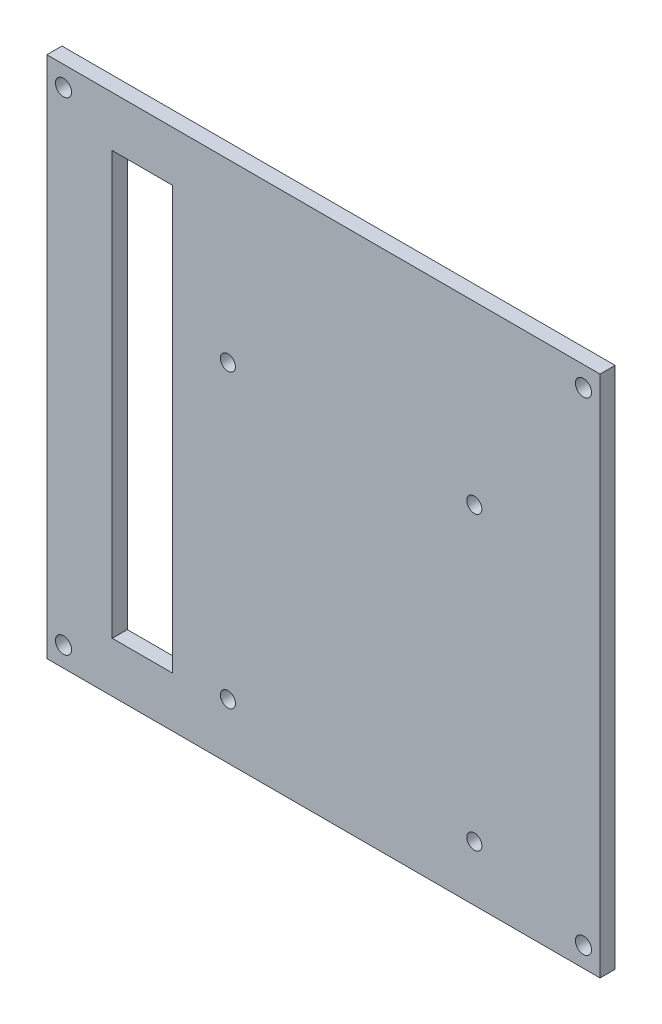
ISO-10303-21;
HEADER;
FILE_DESCRIPTION(('STEP AP214'),'2;1');
FILE_NAME('part.step','',(''),(''),'','','');
FILE_SCHEMA(('AUTOMOTIVE_DESIGN { 1 0 10303 214 1 1 1 1 }'));
ENDSEC;
DATA;
#1=APPLICATION_CONTEXT('core data for automotive mechanical design processes');
#2=APPLICATION_PROTOCOL_DEFINITION('international standard','automotive_design',2000,#1);
#3=PRODUCT_CONTEXT('',#1,'mechanical');
#4=PRODUCT('Part','Part','',(#3));
#5=PRODUCT_RELATED_PRODUCT_CATEGORY('part','',(#4));
#6=PRODUCT_DEFINITION_FORMATION('','',#4);
#7=PRODUCT_DEFINITION_CONTEXT('part definition',#1,'design');
#8=PRODUCT_DEFINITION('design','',#6,#7);
#9=PRODUCT_DEFINITION_SHAPE('','',#8);
#10=(LENGTH_UNIT() NAMED_UNIT(*) SI_UNIT(.MILLI.,.METRE.));
#11=(NAMED_UNIT(*) PLANE_ANGLE_UNIT() SI_UNIT($,.RADIAN.));
#12=(NAMED_UNIT(*) SI_UNIT($,.STERADIAN.) SOLID_ANGLE_UNIT());
#13=UNCERTAINTY_MEASURE_WITH_UNIT(LENGTH_MEASURE(1.E-05),#10,'distance_accuracy_value','');
#14=(GEOMETRIC_REPRESENTATION_CONTEXT(3) GLOBAL_UNCERTAINTY_ASSIGNED_CONTEXT((#13)) GLOBAL_UNIT_ASSIGNED_CONTEXT((#10,
#11,#12)) REPRESENTATION_CONTEXT('',''));
#15=CARTESIAN_POINT('',(0.,0.,0.));
#16=DIRECTION('',(0.,0.,1.));
#17=DIRECTION('',(1.,0.,0.));
#18=AXIS2_PLACEMENT_3D('',#15,#16,#17);
#19=CARTESIAN_POINT('',(0.,82.,3.));
#20=DIRECTION('',(1.,0.,0.));
#21=DIRECTION('',(0.,1.,0.));
#22=AXIS2_PLACEMENT_3D('',#19,#20,#21);
#23=PLANE('',#22);
#24=DIRECTION('',(0.,-1.,0.));
#25=VECTOR('',#24,1.);
#26=CARTESIAN_POINT('',(0.,82.,0.));
#27=LINE('',#26,#25);
#28=CARTESIAN_POINT('',(0.,88.,0.));
#29=VERTEX_POINT('',#28);
#30=CARTESIAN_POINT('',(0.,-16.,0.));
#31=VERTEX_POINT('',#30);
#32=EDGE_CURVE('E36',#29,#31,#27,.T.);
#33=ORIENTED_EDGE('',*,*,#32,.T.);
#34=DIRECTION('',(0.,0.,-1.));
#35=VECTOR('',#34,1.);
#36=CARTESIAN_POINT('',(0.,-16.,3.));
#37=LINE('',#36,#35);
#38=CARTESIAN_POINT('',(0.,-16.,3.));
#39=VERTEX_POINT('',#38);
#40=EDGE_CURVE('E180',#39,#31,#37,.T.);
#41=ORIENTED_EDGE('',*,*,#40,.F.);
#42=DIRECTION('',(0.,-1.,0.));
#43=VECTOR('',#42,1.);
#44=CARTESIAN_POINT('',(0.,82.,3.));
#45=LINE('',#44,#43);
#46=CARTESIAN_POINT('',(0.,88.,3.));
#47=VERTEX_POINT('',#46);
#48=EDGE_CURVE('E11',#47,#39,#45,.T.);
#49=ORIENTED_EDGE('',*,*,#48,.F.);
#50=DIRECTION('',(0.,0.,1.));
#51=VECTOR('',#50,1.);
#52=CARTESIAN_POINT('',(0.,88.,0.));
#53=LINE('',#52,#51);
#54=EDGE_CURVE('E192',#29,#47,#53,.T.);
#55=ORIENTED_EDGE('',*,*,#54,.F.);
#56=EDGE_LOOP('',(#33,#41,#49,#55));
#57=FACE_BOUND('',#56,.T.);
#58=ADVANCED_FACE('F32',(#57),#23,.F.);
#59=CARTESIAN_POINT('',(110.,82.,3.));
#60=DIRECTION('',(1.,0.,0.));
#61=DIRECTION('',(0.,1.,0.));
#62=AXIS2_PLACEMENT_3D('',#59,#60,#61);
#63=PLANE('',#62);
#64=DIRECTION('',(0.,-1.,0.));
#65=VECTOR('',#64,1.);
#66=CARTESIAN_POINT('',(110.,82.,0.));
#67=LINE('',#66,#65);
#68=CARTESIAN_POINT('',(110.,88.,0.));
#69=VERTEX_POINT('',#68);
#70=CARTESIAN_POINT('',(110.,-16.,0.));
#71=VERTEX_POINT('',#70);
#72=EDGE_CURVE('E204',#69,#71,#67,.T.);
#73=ORIENTED_EDGE('',*,*,#72,.F.);
#74=DIRECTION('',(0.,0.,-1.));
#75=VECTOR('',#74,1.);
#76=CARTESIAN_POINT('',(110.,88.,0.));
#77=LINE('',#76,#75);
#78=CARTESIAN_POINT('',(110.,88.,3.));
#79=VERTEX_POINT('',#78);
#80=EDGE_CURVE('E198',#79,#69,#77,.T.);
#81=ORIENTED_EDGE('',*,*,#80,.F.);
#82=DIRECTION('',(0.,-1.,0.));
#83=VECTOR('',#82,1.);
#84=CARTESIAN_POINT('',(110.,82.,3.));
#85=LINE('',#84,#83);
#86=CARTESIAN_POINT('',(110.,-16.,3.));
#87=VERTEX_POINT('',#86);
#88=EDGE_CURVE('E41',#79,#87,#85,.T.);
#89=ORIENTED_EDGE('',*,*,#88,.T.);
#90=DIRECTION('',(0.,0.,1.));
#91=VECTOR('',#90,1.);
#92=CARTESIAN_POINT('',(110.,-16.,3.));
#93=LINE('',#92,#91);
#94=EDGE_CURVE('E186',#71,#87,#93,.T.);
#95=ORIENTED_EDGE('',*,*,#94,.F.);
#96=EDGE_LOOP('',(#73,#81,#89,#95));
#97=FACE_BOUND('',#96,.T.);
#98=ADVANCED_FACE('F34',(#97),#63,.T.);
#99=CARTESIAN_POINT('',(0.,0.,3.));
#100=DIRECTION('',(0.,0.,-1.));
#101=DIRECTION('',(-1.,0.,0.));
#102=AXIS2_PLACEMENT_3D('',#99,#100,#101);
#103=PLANE('',#102);
#104=DIRECTION('',(1.,0.,0.));
#105=VECTOR('',#104,1.);
#106=CARTESIAN_POINT('',(13.,-6.00000000000001,3.));
#107=LINE('',#106,#105);
#108=CARTESIAN_POINT('',(13.,-6.00000000000001,3.));
#109=VERTEX_POINT('',#108);
#110=CARTESIAN_POINT('',(25.,-6.00000000000001,3.));
#111=VERTEX_POINT('',#110);
#112=EDGE_CURVE('E117',#109,#111,#107,.T.);
#113=ORIENTED_EDGE('',*,*,#112,.F.);
#114=DIRECTION('',(0.,-1.,0.));
#115=VECTOR('',#114,1.);
#116=CARTESIAN_POINT('',(13.,78.,3.));
#117=LINE('',#116,#115);
#118=CARTESIAN_POINT('',(13.,78.,3.));
#119=VERTEX_POINT('',#118);
#120=EDGE_CURVE('E49',#119,#109,#117,.T.);
#121=ORIENTED_EDGE('',*,*,#120,.F.);
#122=DIRECTION('',(-1.,0.,0.));
#123=VECTOR('',#122,1.);
#124=CARTESIAN_POINT('',(13.,78.,3.));
#125=LINE('',#124,#123);
#126=CARTESIAN_POINT('',(25.,78.,3.));
#127=VERTEX_POINT('',#126);
#128=EDGE_CURVE('E110',#127,#119,#125,.T.);
#129=ORIENTED_EDGE('',*,*,#128,.F.);
#130=DIRECTION('',(0.,1.,0.));
#131=VECTOR('',#130,1.);
#132=CARTESIAN_POINT('',(25.,78.,3.));
#133=LINE('',#132,#131);
#134=EDGE_CURVE('E124',#111,#127,#133,.T.);
#135=ORIENTED_EDGE('',*,*,#134,.F.);
#136=EDGE_LOOP('',(#113,#121,#129,#135));
#137=FACE_BOUND('',#136,.T.);
#138=CARTESIAN_POINT('',(85.,-5.,3.));
#139=DIRECTION('',(0.,0.,1.));
#140=DIRECTION('',(1.,0.,0.));
#141=AXIS2_PLACEMENT_3D('',#138,#139,#140);
#142=CIRCLE('',#141,1.5);
#143=CARTESIAN_POINT('',(86.5,-5.,3.));
#144=VERTEX_POINT('',#143);
#145=EDGE_CURVE('E133',#144,#144,#142,.T.);
#146=ORIENTED_EDGE('',*,*,#145,.F.);
#147=EDGE_LOOP('',(#146));
#148=FACE_BOUND('',#147,.T.);
#149=CARTESIAN_POINT('',(36.,-5.,3.));
#150=DIRECTION('',(0.,0.,1.));
#151=DIRECTION('',(1.,0.,0.));
#152=AXIS2_PLACEMENT_3D('',#149,#150,#151);
#153=CIRCLE('',#152,1.5);
#154=CARTESIAN_POINT('',(37.5,-5.,3.));
#155=VERTEX_POINT('',#154);
#156=EDGE_CURVE('E139',#155,#155,#153,.T.);
#157=ORIENTED_EDGE('',*,*,#156,.F.);
#158=EDGE_LOOP('',(#157));
#159=FACE_BOUND('',#158,.T.);
#160=CARTESIAN_POINT('',(85.,53.,3.));
#161=DIRECTION('',(0.,0.,1.));
#162=DIRECTION('',(1.,0.,0.));
#163=AXIS2_PLACEMENT_3D('',#160,#161,#162);
#164=CIRCLE('',#163,1.5);
#165=CARTESIAN_POINT('',(86.5,53.,3.));
#166=VERTEX_POINT('',#165);
#167=EDGE_CURVE('E145',#166,#166,#164,.T.);
#168=ORIENTED_EDGE('',*,*,#167,.F.);
#169=EDGE_LOOP('',(#168));
#170=FACE_BOUND('',#169,.T.);
#171=CARTESIAN_POINT('',(36.,53.,3.));
#172=DIRECTION('',(0.,0.,1.));
#173=DIRECTION('',(1.,0.,0.));
#174=AXIS2_PLACEMENT_3D('',#171,#172,#173);
#175=CIRCLE('',#174,1.5);
#176=CARTESIAN_POINT('',(37.5,53.,3.));
#177=VERTEX_POINT('',#176);
#178=EDGE_CURVE('E151',#177,#177,#175,.T.);
#179=ORIENTED_EDGE('',*,*,#178,.F.);
#180=EDGE_LOOP('',(#179));
#181=FACE_BOUND('',#180,.T.);
#182=CARTESIAN_POINT('',(3.3,84.,3.));
#183=DIRECTION('',(0.,0.,1.));
#184=DIRECTION('',(1.,0.,0.));
#185=AXIS2_PLACEMENT_3D('',#182,#183,#184);
#186=CIRCLE('',#185,1.6);
#187=CARTESIAN_POINT('',(4.9,84.,3.));
#188=VERTEX_POINT('',#187);
#189=EDGE_CURVE('E154',#188,#188,#186,.T.);
#190=ORIENTED_EDGE('',*,*,#189,.F.);
#191=EDGE_LOOP('',(#190));
#192=FACE_BOUND('',#191,.T.);
#193=CARTESIAN_POINT('',(3.3,-12.,3.));
#194=DIRECTION('',(0.,0.,1.));
#195=DIRECTION('',(1.,0.,0.));
#196=AXIS2_PLACEMENT_3D('',#193,#194,#195);
#197=CIRCLE('',#196,1.6);
#198=CARTESIAN_POINT('',(4.9,-12.,3.));
#199=VERTEX_POINT('',#198);
#200=EDGE_CURVE('E162',#199,#199,#197,.T.);
#201=ORIENTED_EDGE('',*,*,#200,.F.);
#202=EDGE_LOOP('',(#201));
#203=FACE_BOUND('',#202,.T.);
#204=CARTESIAN_POINT('',(106.7,-12.,3.));
#205=DIRECTION('',(0.,0.,1.));
#206=DIRECTION('',(1.,0.,0.));
#207=AXIS2_PLACEMENT_3D('',#204,#205,#206);
#208=CIRCLE('',#207,1.6);
#209=CARTESIAN_POINT('',(108.3,-12.,3.));
#210=VERTEX_POINT('',#209);
#211=EDGE_CURVE('E168',#210,#210,#208,.T.);
#212=ORIENTED_EDGE('',*,*,#211,.F.);
#213=EDGE_LOOP('',(#212));
#214=FACE_BOUND('',#213,.T.);
#215=CARTESIAN_POINT('',(106.7,84.,3.));
#216=DIRECTION('',(0.,0.,1.));
#217=DIRECTION('',(1.,0.,0.));
#218=AXIS2_PLACEMENT_3D('',#215,#216,#217);
#219=CIRCLE('',#218,1.6);
#220=CARTESIAN_POINT('',(108.3,84.,3.));
#221=VERTEX_POINT('',#220);
#222=EDGE_CURVE('E174',#221,#221,#219,.T.);
#223=ORIENTED_EDGE('',*,*,#222,.F.);
#224=EDGE_LOOP('',(#223));
#225=FACE_BOUND('',#224,.T.);
#226=ORIENTED_EDGE('',*,*,#88,.F.);
#227=DIRECTION('',(1.,0.,0.));
#228=VECTOR('',#227,1.);
#229=CARTESIAN_POINT('',(0.,88.,3.));
#230=LINE('',#229,#228);
#231=EDGE_CURVE('E195',#47,#79,#230,.T.);
#232=ORIENTED_EDGE('',*,*,#231,.F.);
#233=ORIENTED_EDGE('',*,*,#48,.T.);
#234=DIRECTION('',(-1.,0.,0.));
#235=VECTOR('',#234,1.);
#236=CARTESIAN_POINT('',(0.,-16.,3.));
#237=LINE('',#236,#235);
#238=EDGE_CURVE('E189',#87,#39,#237,.T.);
#239=ORIENTED_EDGE('',*,*,#238,.F.);
#240=EDGE_LOOP('',(#226,#232,#233,#239));
#241=FACE_BOUND('',#240,.T.);
#242=ADVANCED_FACE('F216',(#137,#148,#159,#170,#181,#192,#203,#214,#225,#241),#103,.F.);
#243=CARTESIAN_POINT('',(0.,0.,0.));
#244=DIRECTION('',(0.,0.,-1.));
#245=DIRECTION('',(-1.,0.,0.));
#246=AXIS2_PLACEMENT_3D('',#243,#244,#245);
#247=PLANE('',#246);
#248=DIRECTION('',(0.,-1.,0.));
#249=VECTOR('',#248,1.);
#250=CARTESIAN_POINT('',(13.,78.,0.));
#251=LINE('',#250,#249);
#252=CARTESIAN_POINT('',(13.,78.,0.));
#253=VERTEX_POINT('',#252);
#254=CARTESIAN_POINT('',(13.,-6.00000000000001,0.));
#255=VERTEX_POINT('',#254);
#256=EDGE_CURVE('E108',#253,#255,#251,.T.);
#257=ORIENTED_EDGE('',*,*,#256,.T.);
#258=DIRECTION('',(1.,0.,0.));
#259=VECTOR('',#258,1.);
#260=CARTESIAN_POINT('',(13.,-6.00000000000001,0.));
#261=LINE('',#260,#259);
#262=CARTESIAN_POINT('',(25.,-6.00000000000001,0.));
#263=VERTEX_POINT('',#262);
#264=EDGE_CURVE('E97',#255,#263,#261,.T.);
#265=ORIENTED_EDGE('',*,*,#264,.T.);
#266=DIRECTION('',(0.,1.,0.));
#267=VECTOR('',#266,1.);
#268=CARTESIAN_POINT('',(25.,78.,0.));
#269=LINE('',#268,#267);
#270=CARTESIAN_POINT('',(25.,78.,0.));
#271=VERTEX_POINT('',#270);
#272=EDGE_CURVE('E119',#263,#271,#269,.T.);
#273=ORIENTED_EDGE('',*,*,#272,.T.);
#274=DIRECTION('',(-1.,0.,0.));
#275=VECTOR('',#274,1.);
#276=CARTESIAN_POINT('',(13.,78.,0.));
#277=LINE('',#276,#275);
#278=EDGE_CURVE('E115',#271,#253,#277,.T.);
#279=ORIENTED_EDGE('',*,*,#278,.T.);
#280=EDGE_LOOP('',(#257,#265,#273,#279));
#281=FACE_BOUND('',#280,.T.);
#282=CARTESIAN_POINT('',(85.,-5.,0.));
#283=DIRECTION('',(0.,0.,-1.));
#284=DIRECTION('',(-1.,0.,0.));
#285=AXIS2_PLACEMENT_3D('',#282,#283,#284);
#286=CIRCLE('',#285,1.5);
#287=CARTESIAN_POINT('',(86.5,-5.,0.));
#288=VERTEX_POINT('',#287);
#289=EDGE_CURVE('E104',#288,#288,#286,.F.);
#290=ORIENTED_EDGE('',*,*,#289,.T.);
#291=EDGE_LOOP('',(#290));
#292=FACE_BOUND('',#291,.T.);
#293=CARTESIAN_POINT('',(36.,-5.,0.));
#294=DIRECTION('',(0.,0.,-1.));
#295=DIRECTION('',(-1.,0.,0.));
#296=AXIS2_PLACEMENT_3D('',#293,#294,#295);
#297=CIRCLE('',#296,1.5);
#298=CARTESIAN_POINT('',(37.5,-5.,0.));
#299=VERTEX_POINT('',#298);
#300=EDGE_CURVE('E136',#299,#299,#297,.F.);
#301=ORIENTED_EDGE('',*,*,#300,.T.);
#302=EDGE_LOOP('',(#301));
#303=FACE_BOUND('',#302,.T.);
#304=CARTESIAN_POINT('',(85.,53.,0.));
#305=DIRECTION('',(0.,0.,-1.));
#306=DIRECTION('',(-1.,0.,0.));
#307=AXIS2_PLACEMENT_3D('',#304,#305,#306);
#308=CIRCLE('',#307,1.5);
#309=CARTESIAN_POINT('',(86.5,53.,0.));
#310=VERTEX_POINT('',#309);
#311=EDGE_CURVE('E142',#310,#310,#308,.F.);
#312=ORIENTED_EDGE('',*,*,#311,.T.);
#313=EDGE_LOOP('',(#312));
#314=FACE_BOUND('',#313,.T.);
#315=CARTESIAN_POINT('',(36.,53.,0.));
#316=DIRECTION('',(0.,0.,-1.));
#317=DIRECTION('',(-1.,0.,0.));
#318=AXIS2_PLACEMENT_3D('',#315,#316,#317);
#319=CIRCLE('',#318,1.5);
#320=CARTESIAN_POINT('',(37.5,53.,0.));
#321=VERTEX_POINT('',#320);
#322=EDGE_CURVE('E148',#321,#321,#319,.F.);
#323=ORIENTED_EDGE('',*,*,#322,.T.);
#324=EDGE_LOOP('',(#323));
#325=FACE_BOUND('',#324,.T.);
#326=CARTESIAN_POINT('',(3.3,84.,0.));
#327=DIRECTION('',(0.,0.,1.));
#328=DIRECTION('',(1.,0.,0.));
#329=AXIS2_PLACEMENT_3D('',#326,#327,#328);
#330=CIRCLE('',#329,1.6);
#331=CARTESIAN_POINT('',(4.9,84.,0.));
#332=VERTEX_POINT('',#331);
#333=EDGE_CURVE('E159',#332,#332,#330,.T.);
#334=ORIENTED_EDGE('',*,*,#333,.T.);
#335=EDGE_LOOP('',(#334));
#336=FACE_BOUND('',#335,.T.);
#337=CARTESIAN_POINT('',(3.3,-12.,0.));
#338=DIRECTION('',(0.,0.,1.));
#339=DIRECTION('',(1.,0.,0.));
#340=AXIS2_PLACEMENT_3D('',#337,#338,#339);
#341=CIRCLE('',#340,1.6);
#342=CARTESIAN_POINT('',(4.9,-12.,0.));
#343=VERTEX_POINT('',#342);
#344=EDGE_CURVE('E165',#343,#343,#341,.T.);
#345=ORIENTED_EDGE('',*,*,#344,.T.);
#346=EDGE_LOOP('',(#345));
#347=FACE_BOUND('',#346,.T.);
#348=CARTESIAN_POINT('',(106.7,-12.,0.));
#349=DIRECTION('',(0.,0.,1.));
#350=DIRECTION('',(1.,0.,0.));
#351=AXIS2_PLACEMENT_3D('',#348,#349,#350);
#352=CIRCLE('',#351,1.6);
#353=CARTESIAN_POINT('',(108.3,-12.,0.));
#354=VERTEX_POINT('',#353);
#355=EDGE_CURVE('E171',#354,#354,#352,.T.);
#356=ORIENTED_EDGE('',*,*,#355,.T.);
#357=EDGE_LOOP('',(#356));
#358=FACE_BOUND('',#357,.T.);
#359=CARTESIAN_POINT('',(106.7,84.,0.));
#360=DIRECTION('',(0.,0.,1.));
#361=DIRECTION('',(1.,0.,0.));
#362=AXIS2_PLACEMENT_3D('',#359,#360,#361);
#363=CIRCLE('',#362,1.6);
#364=CARTESIAN_POINT('',(108.3,84.,0.));
#365=VERTEX_POINT('',#364);
#366=EDGE_CURVE('E177',#365,#365,#363,.T.);
#367=ORIENTED_EDGE('',*,*,#366,.T.);
#368=EDGE_LOOP('',(#367));
#369=FACE_BOUND('',#368,.T.);
#370=ORIENTED_EDGE('',*,*,#32,.F.);
#371=DIRECTION('',(-1.,0.,0.));
#372=VECTOR('',#371,1.);
#373=CARTESIAN_POINT('',(0.,88.,0.));
#374=LINE('',#373,#372);
#375=EDGE_CURVE('E201',#69,#29,#374,.T.);
#376=ORIENTED_EDGE('',*,*,#375,.F.);
#377=ORIENTED_EDGE('',*,*,#72,.T.);
#378=DIRECTION('',(1.,0.,0.));
#379=VECTOR('',#378,1.);
#380=CARTESIAN_POINT('',(0.,-16.,0.));
#381=LINE('',#380,#379);
#382=EDGE_CURVE('E183',#31,#71,#381,.T.);
#383=ORIENTED_EDGE('',*,*,#382,.F.);
#384=EDGE_LOOP('',(#370,#376,#377,#383));
#385=FACE_BOUND('',#384,.T.);
#386=ADVANCED_FACE('F113',(#281,#292,#303,#314,#325,#336,#347,#358,#369,#385),#247,.T.);
#387=CARTESIAN_POINT('',(0.,88.,0.));
#388=DIRECTION('',(0.,1.,0.));
#389=DIRECTION('',(0.,0.,1.));
#390=AXIS2_PLACEMENT_3D('',#387,#388,#389);
#391=PLANE('',#390);
#392=ORIENTED_EDGE('',*,*,#54,.T.);
#393=ORIENTED_EDGE('',*,*,#231,.T.);
#394=ORIENTED_EDGE('',*,*,#80,.T.);
#395=ORIENTED_EDGE('',*,*,#375,.T.);
#396=EDGE_LOOP('',(#392,#393,#394,#395));
#397=FACE_BOUND('',#396,.T.);
#398=ADVANCED_FACE('F220',(#397),#391,.T.);
#399=CARTESIAN_POINT('',(0.,-16.,0.));
#400=DIRECTION('',(0.,-1.,0.));
#401=DIRECTION('',(0.,0.,-1.));
#402=AXIS2_PLACEMENT_3D('',#399,#400,#401);
#403=PLANE('',#402);
#404=ORIENTED_EDGE('',*,*,#40,.T.);
#405=ORIENTED_EDGE('',*,*,#382,.T.);
#406=ORIENTED_EDGE('',*,*,#94,.T.);
#407=ORIENTED_EDGE('',*,*,#238,.T.);
#408=EDGE_LOOP('',(#404,#405,#406,#407));
#409=FACE_BOUND('',#408,.T.);
#410=ADVANCED_FACE('F213',(#409),#403,.T.);
#411=CARTESIAN_POINT('',(106.7,84.,3.));
#412=DIRECTION('',(0.,0.,1.));
#413=DIRECTION('',(1.,0.,0.));
#414=AXIS2_PLACEMENT_3D('',#411,#412,#413);
#415=CYLINDRICAL_SURFACE('',#414,1.6);
#416=ORIENTED_EDGE('',*,*,#366,.F.);
#417=EDGE_LOOP('',(#416));
#418=FACE_BOUND('',#417,.T.);
#419=ORIENTED_EDGE('',*,*,#222,.T.);
#420=EDGE_LOOP('',(#419));
#421=FACE_BOUND('',#420,.T.);
#422=ADVANCED_FACE('F238',(#418,#421),#415,.F.);
#423=CARTESIAN_POINT('',(106.7,-12.,3.));
#424=DIRECTION('',(0.,0.,1.));
#425=DIRECTION('',(1.,0.,0.));
#426=AXIS2_PLACEMENT_3D('',#423,#424,#425);
#427=CYLINDRICAL_SURFACE('',#426,1.6);
#428=ORIENTED_EDGE('',*,*,#355,.F.);
#429=EDGE_LOOP('',(#428));
#430=FACE_BOUND('',#429,.T.);
#431=ORIENTED_EDGE('',*,*,#211,.T.);
#432=EDGE_LOOP('',(#431));
#433=FACE_BOUND('',#432,.T.);
#434=ADVANCED_FACE('F241',(#430,#433),#427,.F.);
#435=CARTESIAN_POINT('',(3.3,-12.,3.));
#436=DIRECTION('',(0.,0.,1.));
#437=DIRECTION('',(1.,0.,0.));
#438=AXIS2_PLACEMENT_3D('',#435,#436,#437);
#439=CYLINDRICAL_SURFACE('',#438,1.6);
#440=ORIENTED_EDGE('',*,*,#344,.F.);
#441=EDGE_LOOP('',(#440));
#442=FACE_BOUND('',#441,.T.);
#443=ORIENTED_EDGE('',*,*,#200,.T.);
#444=EDGE_LOOP('',(#443));
#445=FACE_BOUND('',#444,.T.);
#446=ADVANCED_FACE('F245',(#442,#445),#439,.F.);
#447=CARTESIAN_POINT('',(3.3,84.,3.));
#448=DIRECTION('',(0.,0.,1.));
#449=DIRECTION('',(1.,0.,0.));
#450=AXIS2_PLACEMENT_3D('',#447,#448,#449);
#451=CYLINDRICAL_SURFACE('',#450,1.6);
#452=ORIENTED_EDGE('',*,*,#333,.F.);
#453=EDGE_LOOP('',(#452));
#454=FACE_BOUND('',#453,.T.);
#455=ORIENTED_EDGE('',*,*,#189,.T.);
#456=EDGE_LOOP('',(#455));
#457=FACE_BOUND('',#456,.T.);
#458=ADVANCED_FACE('F249',(#454,#457),#451,.F.);
#459=CARTESIAN_POINT('',(36.,53.,-0.00100000000000013));
#460=DIRECTION('',(0.,0.,1.));
#461=DIRECTION('',(1.,0.,0.));
#462=AXIS2_PLACEMENT_3D('',#459,#460,#461);
#463=CYLINDRICAL_SURFACE('',#462,1.5);
#464=CARTESIAN_POINT('',(37.5,53.,0.));
#465=CARTESIAN_POINT('',(37.5,53.,0.03125));
#466=CARTESIAN_POINT('',(37.5,53.,0.0625));
#467=CARTESIAN_POINT('',(37.5,53.,0.125));
#468=CARTESIAN_POINT('',(37.5,53.,0.15625));
#469=CARTESIAN_POINT('',(37.5,53.,0.21875));
#470=CARTESIAN_POINT('',(37.5,53.,0.25));
#471=CARTESIAN_POINT('',(37.5,53.,0.3125));
#472=CARTESIAN_POINT('',(37.5,53.,0.34375));
#473=CARTESIAN_POINT('',(37.5,53.,0.40625));
#474=CARTESIAN_POINT('',(37.5,53.,0.4375));
#475=CARTESIAN_POINT('',(37.5,53.,0.5));
#476=CARTESIAN_POINT('',(37.5,53.,0.53125));
#477=CARTESIAN_POINT('',(37.5,53.,0.59375));
#478=CARTESIAN_POINT('',(37.5,53.,0.625));
#479=CARTESIAN_POINT('',(37.5,53.,0.6875));
#480=CARTESIAN_POINT('',(37.5,53.,0.71875));
#481=CARTESIAN_POINT('',(37.5,53.,0.78125));
#482=CARTESIAN_POINT('',(37.5,53.,0.8125));
#483=CARTESIAN_POINT('',(37.5,53.,0.875));
#484=CARTESIAN_POINT('',(37.5,53.,0.90625));
#485=CARTESIAN_POINT('',(37.5,53.,0.96875));
#486=CARTESIAN_POINT('',(37.5,53.,1.));
#487=CARTESIAN_POINT('',(37.5,53.,1.0625));
#488=CARTESIAN_POINT('',(37.5,53.,1.09375));
#489=CARTESIAN_POINT('',(37.5,53.,1.15625));
#490=CARTESIAN_POINT('',(37.5,53.,1.1875));
#491=CARTESIAN_POINT('',(37.5,53.,1.25));
#492=CARTESIAN_POINT('',(37.5,53.,1.28125));
#493=CARTESIAN_POINT('',(37.5,53.,1.34375));
#494=CARTESIAN_POINT('',(37.5,53.,1.375));
#495=CARTESIAN_POINT('',(37.5,53.,1.4375));
#496=CARTESIAN_POINT('',(37.5,53.,1.46875));
#497=CARTESIAN_POINT('',(37.5,53.,1.53125));
#498=CARTESIAN_POINT('',(37.5,53.,1.5625));
#499=CARTESIAN_POINT('',(37.5,53.,1.625));
#500=CARTESIAN_POINT('',(37.5,53.,1.65625));
#501=CARTESIAN_POINT('',(37.5,53.,1.71875));
#502=CARTESIAN_POINT('',(37.5,53.,1.75));
#503=CARTESIAN_POINT('',(37.5,53.,1.8125));
#504=CARTESIAN_POINT('',(37.5,53.,1.84375));
#505=CARTESIAN_POINT('',(37.5,53.,1.90625));
#506=CARTESIAN_POINT('',(37.5,53.,1.9375));
#507=CARTESIAN_POINT('',(37.5,53.,2.));
#508=CARTESIAN_POINT('',(37.5,53.,2.03125));
#509=CARTESIAN_POINT('',(37.5,53.,2.09375));
#510=CARTESIAN_POINT('',(37.5,53.,2.125));
#511=CARTESIAN_POINT('',(37.5,53.,2.1875));
#512=CARTESIAN_POINT('',(37.5,53.,2.21875));
#513=CARTESIAN_POINT('',(37.5,53.,2.28125));
#514=CARTESIAN_POINT('',(37.5,53.,2.3125));
#515=CARTESIAN_POINT('',(37.5,53.,2.375));
#516=CARTESIAN_POINT('',(37.5,53.,2.40625));
#517=CARTESIAN_POINT('',(37.5,53.,2.46875));
#518=CARTESIAN_POINT('',(37.5,53.,2.5));
#519=CARTESIAN_POINT('',(37.5,53.,2.5625));
#520=CARTESIAN_POINT('',(37.5,53.,2.59375));
#521=CARTESIAN_POINT('',(37.5,53.,2.65625));
#522=CARTESIAN_POINT('',(37.5,53.,2.6875));
#523=CARTESIAN_POINT('',(37.5,53.,2.75));
#524=CARTESIAN_POINT('',(37.5,53.,2.78125));
#525=CARTESIAN_POINT('',(37.5,53.,2.84375));
#526=CARTESIAN_POINT('',(37.5,53.,2.875));
#527=CARTESIAN_POINT('',(37.5,53.,2.9375));
#528=CARTESIAN_POINT('',(37.5,53.,2.96875));
#529=CARTESIAN_POINT('',(37.5,53.,3.));
#530=B_SPLINE_CURVE_WITH_KNOTS('',3,(#464,#465,#466,#467,#468,#469,#470,#471,#472,#473,#474,
#475,#476,#477,#478,#479,#480,#481,#482,#483,#484,#485,#486,#487,#488,#489,#490,#491,#492,#493,
#494,#495,#496,#497,#498,#499,#500,#501,#502,#503,#504,#505,#506,#507,#508,#509,#510,#511,#512,
#513,#514,#515,#516,#517,#518,#519,#520,#521,#522,#523,#524,#525,#526,#527,#528,#529),
.UNSPECIFIED.,.F.,.F.,(4,2,2,2,2,2,2,2,2,2,2,2,2,2,2,2,2,2,2,2,2,2,2,2,2,2,2,2,2,2,2,2,4),(0.,
0.09375,0.1875,0.28125,0.375,0.46875,0.5625,0.65625,0.75,0.84375,0.9375,1.03125,1.125,1.21875,
1.3125,1.40625,1.5,1.59375,1.6875,1.78125,1.875,1.96875,2.0625,2.15625,2.25,2.34375,2.4375,
2.53125,2.625,2.71875,2.8125,2.90625,3.),.UNSPECIFIED.);
#531=EDGE_CURVE('BSEAM253',#321,#177,#530,.T.);
#532=ORIENTED_EDGE('',*,*,#322,.F.);
#533=ORIENTED_EDGE('',*,*,#178,.T.);
#534=ORIENTED_EDGE('',*,*,#531,.T.);
#535=ORIENTED_EDGE('',*,*,#531,.F.);
#536=EDGE_LOOP('',(#532,#534,#533,#535));
#537=FACE_BOUND('',#536,.T.);
#538=ADVANCED_FACE('F253',(#537),#463,.F.);
#539=CARTESIAN_POINT('',(85.,53.,-0.00100000000000013));
#540=DIRECTION('',(0.,0.,1.));
#541=DIRECTION('',(1.,0.,0.));
#542=AXIS2_PLACEMENT_3D('',#539,#540,#541);
#543=CYLINDRICAL_SURFACE('',#542,1.5);
#544=CARTESIAN_POINT('',(86.5,53.,0.));
#545=CARTESIAN_POINT('',(86.5,53.,0.03125));
#546=CARTESIAN_POINT('',(86.5,53.,0.0625));
#547=CARTESIAN_POINT('',(86.5,53.,0.125));
#548=CARTESIAN_POINT('',(86.5,53.,0.15625));
#549=CARTESIAN_POINT('',(86.5,53.,0.21875));
#550=CARTESIAN_POINT('',(86.5,53.,0.25));
#551=CARTESIAN_POINT('',(86.5,53.,0.3125));
#552=CARTESIAN_POINT('',(86.5,53.,0.34375));
#553=CARTESIAN_POINT('',(86.5,53.,0.40625));
#554=CARTESIAN_POINT('',(86.5,53.,0.4375));
#555=CARTESIAN_POINT('',(86.5,53.,0.5));
#556=CARTESIAN_POINT('',(86.5,53.,0.53125));
#557=CARTESIAN_POINT('',(86.5,53.,0.59375));
#558=CARTESIAN_POINT('',(86.5,53.,0.625));
#559=CARTESIAN_POINT('',(86.5,53.,0.6875));
#560=CARTESIAN_POINT('',(86.5,53.,0.71875));
#561=CARTESIAN_POINT('',(86.5,53.,0.78125));
#562=CARTESIAN_POINT('',(86.5,53.,0.8125));
#563=CARTESIAN_POINT('',(86.5,53.,0.875));
#564=CARTESIAN_POINT('',(86.5,53.,0.90625));
#565=CARTESIAN_POINT('',(86.5,53.,0.96875));
#566=CARTESIAN_POINT('',(86.5,53.,1.));
#567=CARTESIAN_POINT('',(86.5,53.,1.0625));
#568=CARTESIAN_POINT('',(86.5,53.,1.09375));
#569=CARTESIAN_POINT('',(86.5,53.,1.15625));
#570=CARTESIAN_POINT('',(86.5,53.,1.1875));
#571=CARTESIAN_POINT('',(86.5,53.,1.25));
#572=CARTESIAN_POINT('',(86.5,53.,1.28125));
#573=CARTESIAN_POINT('',(86.5,53.,1.34375));
#574=CARTESIAN_POINT('',(86.5,53.,1.375));
#575=CARTESIAN_POINT('',(86.5,53.,1.4375));
#576=CARTESIAN_POINT('',(86.5,53.,1.46875));
#577=CARTESIAN_POINT('',(86.5,53.,1.53125));
#578=CARTESIAN_POINT('',(86.5,53.,1.5625));
#579=CARTESIAN_POINT('',(86.5,53.,1.625));
#580=CARTESIAN_POINT('',(86.5,53.,1.65625));
#581=CARTESIAN_POINT('',(86.5,53.,1.71875));
#582=CARTESIAN_POINT('',(86.5,53.,1.75));
#583=CARTESIAN_POINT('',(86.5,53.,1.8125));
#584=CARTESIAN_POINT('',(86.5,53.,1.84375));
#585=CARTESIAN_POINT('',(86.5,53.,1.90625));
#586=CARTESIAN_POINT('',(86.5,53.,1.9375));
#587=CARTESIAN_POINT('',(86.5,53.,2.));
#588=CARTESIAN_POINT('',(86.5,53.,2.03125));
#589=CARTESIAN_POINT('',(86.5,53.,2.09375));
#590=CARTESIAN_POINT('',(86.5,53.,2.125));
#591=CARTESIAN_POINT('',(86.5,53.,2.1875));
#592=CARTESIAN_POINT('',(86.5,53.,2.21875));
#593=CARTESIAN_POINT('',(86.5,53.,2.28125));
#594=CARTESIAN_POINT('',(86.5,53.,2.3125));
#595=CARTESIAN_POINT('',(86.5,53.,2.375));
#596=CARTESIAN_POINT('',(86.5,53.,2.40625));
#597=CARTESIAN_POINT('',(86.5,53.,2.46875));
#598=CARTESIAN_POINT('',(86.5,53.,2.5));
#599=CARTESIAN_POINT('',(86.5,53.,2.5625));
#600=CARTESIAN_POINT('',(86.5,53.,2.59375));
#601=CARTESIAN_POINT('',(86.5,53.,2.65625));
#602=CARTESIAN_POINT('',(86.5,53.,2.6875));
#603=CARTESIAN_POINT('',(86.5,53.,2.75));
#604=CARTESIAN_POINT('',(86.5,53.,2.78125));
#605=CARTESIAN_POINT('',(86.5,53.,2.84375));
#606=CARTESIAN_POINT('',(86.5,53.,2.875));
#607=CARTESIAN_POINT('',(86.5,53.,2.9375));
#608=CARTESIAN_POINT('',(86.5,53.,2.96875));
#609=CARTESIAN_POINT('',(86.5,53.,3.));
#610=B_SPLINE_CURVE_WITH_KNOTS('',3,(#544,#545,#546,#547,#548,#549,#550,#551,#552,#553,#554,
#555,#556,#557,#558,#559,#560,#561,#562,#563,#564,#565,#566,#567,#568,#569,#570,#571,#572,#573,
#574,#575,#576,#577,#578,#579,#580,#581,#582,#583,#584,#585,#586,#587,#588,#589,#590,#591,#592,
#593,#594,#595,#596,#597,#598,#599,#600,#601,#602,#603,#604,#605,#606,#607,#608,#609),
.UNSPECIFIED.,.F.,.F.,(4,2,2,2,2,2,2,2,2,2,2,2,2,2,2,2,2,2,2,2,2,2,2,2,2,2,2,2,2,2,2,2,4),(0.,
0.09375,0.1875,0.28125,0.375,0.46875,0.5625,0.65625,0.75,0.84375,0.9375,1.03125,1.125,1.21875,
1.3125,1.40625,1.5,1.59375,1.6875,1.78125,1.875,1.96875,2.0625,2.15625,2.25,2.34375,2.4375,
2.53125,2.625,2.71875,2.8125,2.90625,3.),.UNSPECIFIED.);
#611=EDGE_CURVE('BSEAM257',#310,#166,#610,.T.);
#612=ORIENTED_EDGE('',*,*,#311,.F.);
#613=ORIENTED_EDGE('',*,*,#167,.T.);
#614=ORIENTED_EDGE('',*,*,#611,.T.);
#615=ORIENTED_EDGE('',*,*,#611,.F.);
#616=EDGE_LOOP('',(#612,#614,#613,#615));
#617=FACE_BOUND('',#616,.T.);
#618=ADVANCED_FACE('F257',(#617),#543,.F.);
#619=CARTESIAN_POINT('',(36.,-5.,-0.00100000000000013));
#620=DIRECTION('',(0.,0.,1.));
#621=DIRECTION('',(1.,0.,0.));
#622=AXIS2_PLACEMENT_3D('',#619,#620,#621);
#623=CYLINDRICAL_SURFACE('',#622,1.5);
#624=CARTESIAN_POINT('',(37.5,-5.,0.));
#625=CARTESIAN_POINT('',(37.5,-5.,0.03125));
#626=CARTESIAN_POINT('',(37.5,-5.,0.0625));
#627=CARTESIAN_POINT('',(37.5,-5.,0.125));
#628=CARTESIAN_POINT('',(37.5,-5.,0.15625));
#629=CARTESIAN_POINT('',(37.5,-5.,0.21875));
#630=CARTESIAN_POINT('',(37.5,-5.,0.25));
#631=CARTESIAN_POINT('',(37.5,-5.,0.3125));
#632=CARTESIAN_POINT('',(37.5,-5.,0.34375));
#633=CARTESIAN_POINT('',(37.5,-5.,0.40625));
#634=CARTESIAN_POINT('',(37.5,-5.,0.4375));
#635=CARTESIAN_POINT('',(37.5,-5.,0.5));
#636=CARTESIAN_POINT('',(37.5,-5.,0.53125));
#637=CARTESIAN_POINT('',(37.5,-5.,0.59375));
#638=CARTESIAN_POINT('',(37.5,-5.,0.625));
#639=CARTESIAN_POINT('',(37.5,-5.,0.6875));
#640=CARTESIAN_POINT('',(37.5,-5.,0.71875));
#641=CARTESIAN_POINT('',(37.5,-5.,0.78125));
#642=CARTESIAN_POINT('',(37.5,-5.,0.8125));
#643=CARTESIAN_POINT('',(37.5,-5.,0.875));
#644=CARTESIAN_POINT('',(37.5,-5.,0.90625));
#645=CARTESIAN_POINT('',(37.5,-5.,0.96875));
#646=CARTESIAN_POINT('',(37.5,-5.,1.));
#647=CARTESIAN_POINT('',(37.5,-5.,1.0625));
#648=CARTESIAN_POINT('',(37.5,-5.,1.09375));
#649=CARTESIAN_POINT('',(37.5,-5.,1.15625));
#650=CARTESIAN_POINT('',(37.5,-5.,1.1875));
#651=CARTESIAN_POINT('',(37.5,-5.,1.25));
#652=CARTESIAN_POINT('',(37.5,-5.,1.28125));
#653=CARTESIAN_POINT('',(37.5,-5.,1.34375));
#654=CARTESIAN_POINT('',(37.5,-5.,1.375));
#655=CARTESIAN_POINT('',(37.5,-5.,1.4375));
#656=CARTESIAN_POINT('',(37.5,-5.,1.46875));
#657=CARTESIAN_POINT('',(37.5,-5.,1.53125));
#658=CARTESIAN_POINT('',(37.5,-5.,1.5625));
#659=CARTESIAN_POINT('',(37.5,-5.,1.625));
#660=CARTESIAN_POINT('',(37.5,-5.,1.65625));
#661=CARTESIAN_POINT('',(37.5,-5.,1.71875));
#662=CARTESIAN_POINT('',(37.5,-5.,1.75));
#663=CARTESIAN_POINT('',(37.5,-5.,1.8125));
#664=CARTESIAN_POINT('',(37.5,-5.,1.84375));
#665=CARTESIAN_POINT('',(37.5,-5.,1.90625));
#666=CARTESIAN_POINT('',(37.5,-5.,1.9375));
#667=CARTESIAN_POINT('',(37.5,-5.,2.));
#668=CARTESIAN_POINT('',(37.5,-5.,2.03125));
#669=CARTESIAN_POINT('',(37.5,-5.,2.09375));
#670=CARTESIAN_POINT('',(37.5,-5.,2.125));
#671=CARTESIAN_POINT('',(37.5,-5.,2.1875));
#672=CARTESIAN_POINT('',(37.5,-5.,2.21875));
#673=CARTESIAN_POINT('',(37.5,-5.,2.28125));
#674=CARTESIAN_POINT('',(37.5,-5.,2.3125));
#675=CARTESIAN_POINT('',(37.5,-5.,2.375));
#676=CARTESIAN_POINT('',(37.5,-5.,2.40625));
#677=CARTESIAN_POINT('',(37.5,-5.,2.46875));
#678=CARTESIAN_POINT('',(37.5,-5.,2.5));
#679=CARTESIAN_POINT('',(37.5,-5.,2.5625));
#680=CARTESIAN_POINT('',(37.5,-5.,2.59375));
#681=CARTESIAN_POINT('',(37.5,-5.,2.65625));
#682=CARTESIAN_POINT('',(37.5,-5.,2.6875));
#683=CARTESIAN_POINT('',(37.5,-5.,2.75));
#684=CARTESIAN_POINT('',(37.5,-5.,2.78125));
#685=CARTESIAN_POINT('',(37.5,-5.,2.84375));
#686=CARTESIAN_POINT('',(37.5,-5.,2.875));
#687=CARTESIAN_POINT('',(37.5,-5.,2.9375));
#688=CARTESIAN_POINT('',(37.5,-5.,2.96875));
#689=CARTESIAN_POINT('',(37.5,-5.,3.));
#690=B_SPLINE_CURVE_WITH_KNOTS('',3,(#624,#625,#626,#627,#628,#629,#630,#631,#632,#633,#634,
#635,#636,#637,#638,#639,#640,#641,#642,#643,#644,#645,#646,#647,#648,#649,#650,#651,#652,#653,
#654,#655,#656,#657,#658,#659,#660,#661,#662,#663,#664,#665,#666,#667,#668,#669,#670,#671,#672,
#673,#674,#675,#676,#677,#678,#679,#680,#681,#682,#683,#684,#685,#686,#687,#688,#689),
.UNSPECIFIED.,.F.,.F.,(4,2,2,2,2,2,2,2,2,2,2,2,2,2,2,2,2,2,2,2,2,2,2,2,2,2,2,2,2,2,2,2,4),(0.,
0.09375,0.1875,0.28125,0.375,0.46875,0.5625,0.65625,0.75,0.84375,0.9375,1.03125,1.125,1.21875,
1.3125,1.40625,1.5,1.59375,1.6875,1.78125,1.875,1.96875,2.0625,2.15625,2.25,2.34375,2.4375,
2.53125,2.625,2.71875,2.8125,2.90625,3.),.UNSPECIFIED.);
#691=EDGE_CURVE('BSEAM261',#299,#155,#690,.T.);
#692=ORIENTED_EDGE('',*,*,#300,.F.);
#693=ORIENTED_EDGE('',*,*,#156,.T.);
#694=ORIENTED_EDGE('',*,*,#691,.T.);
#695=ORIENTED_EDGE('',*,*,#691,.F.);
#696=EDGE_LOOP('',(#692,#694,#693,#695));
#697=FACE_BOUND('',#696,.T.);
#698=ADVANCED_FACE('F261',(#697),#623,.F.);
#699=CARTESIAN_POINT('',(85.,-5.,-0.00100000000000013));
#700=DIRECTION('',(0.,0.,1.));
#701=DIRECTION('',(1.,0.,0.));
#702=AXIS2_PLACEMENT_3D('',#699,#700,#701);
#703=CYLINDRICAL_SURFACE('',#702,1.5);
#704=CARTESIAN_POINT('',(86.5,-5.,0.));
#705=CARTESIAN_POINT('',(86.5,-5.,0.03125));
#706=CARTESIAN_POINT('',(86.5,-5.,0.0625));
#707=CARTESIAN_POINT('',(86.5,-5.,0.125));
#708=CARTESIAN_POINT('',(86.5,-5.,0.15625));
#709=CARTESIAN_POINT('',(86.5,-5.,0.21875));
#710=CARTESIAN_POINT('',(86.5,-5.,0.25));
#711=CARTESIAN_POINT('',(86.5,-5.,0.3125));
#712=CARTESIAN_POINT('',(86.5,-5.,0.34375));
#713=CARTESIAN_POINT('',(86.5,-5.,0.40625));
#714=CARTESIAN_POINT('',(86.5,-5.,0.4375));
#715=CARTESIAN_POINT('',(86.5,-5.,0.5));
#716=CARTESIAN_POINT('',(86.5,-5.,0.53125));
#717=CARTESIAN_POINT('',(86.5,-5.,0.59375));
#718=CARTESIAN_POINT('',(86.5,-5.,0.625));
#719=CARTESIAN_POINT('',(86.5,-5.,0.6875));
#720=CARTESIAN_POINT('',(86.5,-5.,0.71875));
#721=CARTESIAN_POINT('',(86.5,-5.,0.78125));
#722=CARTESIAN_POINT('',(86.5,-5.,0.8125));
#723=CARTESIAN_POINT('',(86.5,-5.,0.875));
#724=CARTESIAN_POINT('',(86.5,-5.,0.90625));
#725=CARTESIAN_POINT('',(86.5,-5.,0.96875));
#726=CARTESIAN_POINT('',(86.5,-5.,1.));
#727=CARTESIAN_POINT('',(86.5,-5.,1.0625));
#728=CARTESIAN_POINT('',(86.5,-5.,1.09375));
#729=CARTESIAN_POINT('',(86.5,-5.,1.15625));
#730=CARTESIAN_POINT('',(86.5,-5.,1.1875));
#731=CARTESIAN_POINT('',(86.5,-5.,1.25));
#732=CARTESIAN_POINT('',(86.5,-5.,1.28125));
#733=CARTESIAN_POINT('',(86.5,-5.,1.34375));
#734=CARTESIAN_POINT('',(86.5,-5.,1.375));
#735=CARTESIAN_POINT('',(86.5,-5.,1.4375));
#736=CARTESIAN_POINT('',(86.5,-5.,1.46875));
#737=CARTESIAN_POINT('',(86.5,-5.,1.53125));
#738=CARTESIAN_POINT('',(86.5,-5.,1.5625));
#739=CARTESIAN_POINT('',(86.5,-5.,1.625));
#740=CARTESIAN_POINT('',(86.5,-5.,1.65625));
#741=CARTESIAN_POINT('',(86.5,-5.,1.71875));
#742=CARTESIAN_POINT('',(86.5,-5.,1.75));
#743=CARTESIAN_POINT('',(86.5,-5.,1.8125));
#744=CARTESIAN_POINT('',(86.5,-5.,1.84375));
#745=CARTESIAN_POINT('',(86.5,-5.,1.90625));
#746=CARTESIAN_POINT('',(86.5,-5.,1.9375));
#747=CARTESIAN_POINT('',(86.5,-5.,2.));
#748=CARTESIAN_POINT('',(86.5,-5.,2.03125));
#749=CARTESIAN_POINT('',(86.5,-5.,2.09375));
#750=CARTESIAN_POINT('',(86.5,-5.,2.125));
#751=CARTESIAN_POINT('',(86.5,-5.,2.1875));
#752=CARTESIAN_POINT('',(86.5,-5.,2.21875));
#753=CARTESIAN_POINT('',(86.5,-5.,2.28125));
#754=CARTESIAN_POINT('',(86.5,-5.,2.3125));
#755=CARTESIAN_POINT('',(86.5,-5.,2.375));
#756=CARTESIAN_POINT('',(86.5,-5.,2.40625));
#757=CARTESIAN_POINT('',(86.5,-5.,2.46875));
#758=CARTESIAN_POINT('',(86.5,-5.,2.5));
#759=CARTESIAN_POINT('',(86.5,-5.,2.5625));
#760=CARTESIAN_POINT('',(86.5,-5.,2.59375));
#761=CARTESIAN_POINT('',(86.5,-5.,2.65625));
#762=CARTESIAN_POINT('',(86.5,-5.,2.6875));
#763=CARTESIAN_POINT('',(86.5,-5.,2.75));
#764=CARTESIAN_POINT('',(86.5,-5.,2.78125));
#765=CARTESIAN_POINT('',(86.5,-5.,2.84375));
#766=CARTESIAN_POINT('',(86.5,-5.,2.875));
#767=CARTESIAN_POINT('',(86.5,-5.,2.9375));
#768=CARTESIAN_POINT('',(86.5,-5.,2.96875));
#769=CARTESIAN_POINT('',(86.5,-5.,3.));
#770=B_SPLINE_CURVE_WITH_KNOTS('',3,(#704,#705,#706,#707,#708,#709,#710,#711,#712,#713,#714,
#715,#716,#717,#718,#719,#720,#721,#722,#723,#724,#725,#726,#727,#728,#729,#730,#731,#732,#733,
#734,#735,#736,#737,#738,#739,#740,#741,#742,#743,#744,#745,#746,#747,#748,#749,#750,#751,#752,
#753,#754,#755,#756,#757,#758,#759,#760,#761,#762,#763,#764,#765,#766,#767,#768,#769),
.UNSPECIFIED.,.F.,.F.,(4,2,2,2,2,2,2,2,2,2,2,2,2,2,2,2,2,2,2,2,2,2,2,2,2,2,2,2,2,2,2,2,4),(0.,
0.09375,0.1875,0.28125,0.375,0.46875,0.5625,0.65625,0.75,0.84375,0.9375,1.03125,1.125,1.21875,
1.3125,1.40625,1.5,1.59375,1.6875,1.78125,1.875,1.96875,2.0625,2.15625,2.25,2.34375,2.4375,
2.53125,2.625,2.71875,2.8125,2.90625,3.),.UNSPECIFIED.);
#771=EDGE_CURVE('BSEAM265',#288,#144,#770,.T.);
#772=ORIENTED_EDGE('',*,*,#289,.F.);
#773=ORIENTED_EDGE('',*,*,#145,.T.);
#774=ORIENTED_EDGE('',*,*,#771,.T.);
#775=ORIENTED_EDGE('',*,*,#771,.F.);
#776=EDGE_LOOP('',(#772,#774,#773,#775));
#777=FACE_BOUND('',#776,.T.);
#778=ADVANCED_FACE('F265',(#777),#703,.F.);
#779=CARTESIAN_POINT('',(13.,78.,-0.00100000000000013));
#780=DIRECTION('',(-1.,0.,0.));
#781=DIRECTION('',(0.,-1.,0.));
#782=AXIS2_PLACEMENT_3D('',#779,#780,#781);
#783=PLANE('',#782);
#784=DIRECTION('',(0.,0.,1.));
#785=VECTOR('',#784,1.);
#786=CARTESIAN_POINT('',(13.,78.,-0.00100000000000013));
#787=LINE('',#786,#785);
#788=EDGE_CURVE('E105',#253,#119,#787,.T.);
#789=ORIENTED_EDGE('',*,*,#788,.T.);
#790=ORIENTED_EDGE('',*,*,#120,.T.);
#791=DIRECTION('',(0.,0.,1.));
#792=VECTOR('',#791,1.);
#793=CARTESIAN_POINT('',(13.,-6.00000000000001,-0.00100000000000013));
#794=LINE('',#793,#792);
#795=EDGE_CURVE('E99',#255,#109,#794,.T.);
#796=ORIENTED_EDGE('',*,*,#795,.F.);
#797=ORIENTED_EDGE('',*,*,#256,.F.);
#798=EDGE_LOOP('',(#789,#790,#796,#797));
#799=FACE_BOUND('',#798,.T.);
#800=ADVANCED_FACE('F107',(#799),#783,.F.);
#801=CARTESIAN_POINT('',(13.,78.,-0.00100000000000013));
#802=DIRECTION('',(0.,1.,0.));
#803=DIRECTION('',(0.,0.,1.));
#804=AXIS2_PLACEMENT_3D('',#801,#802,#803);
#805=PLANE('',#804);
#806=DIRECTION('',(0.,0.,1.));
#807=VECTOR('',#806,1.);
#808=CARTESIAN_POINT('',(25.,78.,-0.00100000000000013));
#809=LINE('',#808,#807);
#810=EDGE_CURVE('E130',#271,#127,#809,.T.);
#811=ORIENTED_EDGE('',*,*,#810,.T.);
#812=ORIENTED_EDGE('',*,*,#128,.T.);
#813=ORIENTED_EDGE('',*,*,#788,.F.);
#814=ORIENTED_EDGE('',*,*,#278,.F.);
#815=EDGE_LOOP('',(#811,#812,#813,#814));
#816=FACE_BOUND('',#815,.T.);
#817=ADVANCED_FACE('F272',(#816),#805,.F.);
#818=CARTESIAN_POINT('',(25.,78.,-0.00100000000000013));
#819=DIRECTION('',(1.,0.,0.));
#820=DIRECTION('',(0.,1.,0.));
#821=AXIS2_PLACEMENT_3D('',#818,#819,#820);
#822=PLANE('',#821);
#823=DIRECTION('',(0.,0.,1.));
#824=VECTOR('',#823,1.);
#825=CARTESIAN_POINT('',(25.,-6.00000000000001,-0.00100000000000013));
#826=LINE('',#825,#824);
#827=EDGE_CURVE('E57',#263,#111,#826,.T.);
#828=ORIENTED_EDGE('',*,*,#827,.T.);
#829=ORIENTED_EDGE('',*,*,#134,.T.);
#830=ORIENTED_EDGE('',*,*,#810,.F.);
#831=ORIENTED_EDGE('',*,*,#272,.F.);
#832=EDGE_LOOP('',(#828,#829,#830,#831));
#833=FACE_BOUND('',#832,.T.);
#834=ADVANCED_FACE('F275',(#833),#822,.F.);
#835=CARTESIAN_POINT('',(13.,-6.00000000000001,-0.00100000000000013));
#836=DIRECTION('',(0.,-1.,0.));
#837=DIRECTION('',(1.,0.,0.));
#838=AXIS2_PLACEMENT_3D('',#835,#836,#837);
#839=PLANE('',#838);
#840=ORIENTED_EDGE('',*,*,#795,.T.);
#841=ORIENTED_EDGE('',*,*,#112,.T.);
#842=ORIENTED_EDGE('',*,*,#827,.F.);
#843=ORIENTED_EDGE('',*,*,#264,.F.);
#844=EDGE_LOOP('',(#840,#841,#842,#843));
#845=FACE_BOUND('',#844,.T.);
#846=ADVANCED_FACE('F98',(#845),#839,.F.);
#847=CLOSED_SHELL('',(#58,#98,#242,#386,#398,#410,#422,#434,#446,#458,#538,#618,#698,#778,#800,
#817,#834,#846));
#848=MANIFOLD_SOLID_BREP('B2',#847);
#849=ADVANCED_BREP_SHAPE_REPRESENTATION('',(#18,#848),#14);
#850=SHAPE_DEFINITION_REPRESENTATION(#9,#849);
ENDSEC;
END-ISO-10303-21;
